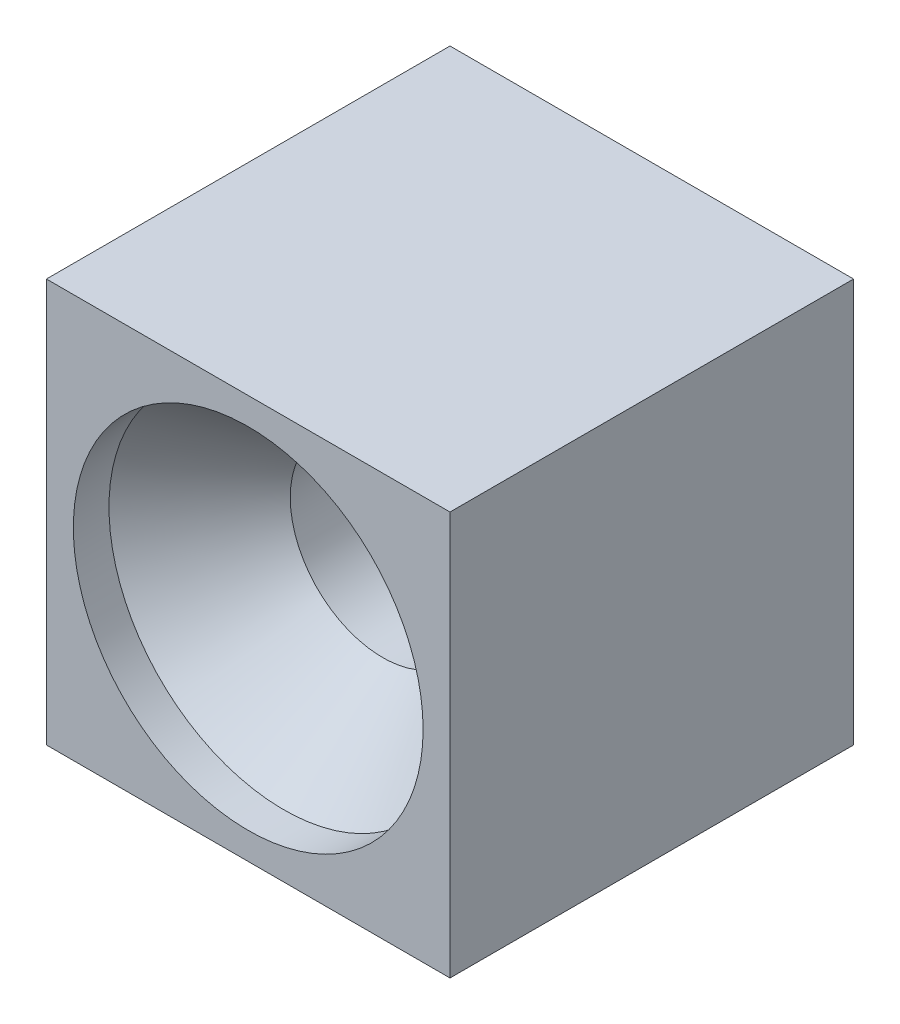
ISO-10303-21;
HEADER;
FILE_DESCRIPTION(('STEP AP214'),'2;1');
FILE_NAME('part.step','',(''),(''),'','','');
FILE_SCHEMA(('AUTOMOTIVE_DESIGN { 1 0 10303 214 1 1 1 1 }'));
ENDSEC;
DATA;
#1=APPLICATION_CONTEXT('core data for automotive mechanical design processes');
#2=APPLICATION_PROTOCOL_DEFINITION('international standard','automotive_design',2000,#1);
#3=PRODUCT_CONTEXT('',#1,'mechanical');
#4=PRODUCT('Part','Part','',(#3));
#5=PRODUCT_RELATED_PRODUCT_CATEGORY('part','',(#4));
#6=PRODUCT_DEFINITION_FORMATION('','',#4);
#7=PRODUCT_DEFINITION_CONTEXT('part definition',#1,'design');
#8=PRODUCT_DEFINITION('design','',#6,#7);
#9=PRODUCT_DEFINITION_SHAPE('','',#8);
#10=(LENGTH_UNIT() NAMED_UNIT(*) SI_UNIT(.MILLI.,.METRE.));
#11=(NAMED_UNIT(*) PLANE_ANGLE_UNIT() SI_UNIT($,.RADIAN.));
#12=(NAMED_UNIT(*) SI_UNIT($,.STERADIAN.) SOLID_ANGLE_UNIT());
#13=UNCERTAINTY_MEASURE_WITH_UNIT(LENGTH_MEASURE(1.E-05),#10,'distance_accuracy_value','');
#14=(GEOMETRIC_REPRESENTATION_CONTEXT(3) GLOBAL_UNCERTAINTY_ASSIGNED_CONTEXT((#13)) GLOBAL_UNIT_ASSIGNED_CONTEXT((#10,
#11,#12)) REPRESENTATION_CONTEXT('',''));
#15=CARTESIAN_POINT('',(0.,0.,0.));
#16=DIRECTION('',(0.,0.,1.));
#17=DIRECTION('',(1.,0.,0.));
#18=AXIS2_PLACEMENT_3D('',#15,#16,#17);
#19=CARTESIAN_POINT('',(0.,0.,12.));
#20=DIRECTION('',(0.,0.,-1.));
#21=DIRECTION('',(-1.,0.,0.));
#22=AXIS2_PLACEMENT_3D('',#19,#20,#21);
#23=CYLINDRICAL_SURFACE('',#22,2.75);
#24=CARTESIAN_POINT('',(0.,0.,0.5));
#25=DIRECTION('',(0.,0.,1.));
#26=DIRECTION('',(1.,0.,0.));
#27=AXIS2_PLACEMENT_3D('',#24,#25,#26);
#28=CIRCLE('',#27,2.75);
#29=CARTESIAN_POINT('',(2.75,0.,0.5));
#30=VERTEX_POINT('',#29);
#31=EDGE_CURVE('E11',#30,#30,#28,.F.);
#32=ORIENTED_EDGE('',*,*,#31,.T.);
#33=EDGE_LOOP('',(#32));
#34=FACE_BOUND('',#33,.T.);
#35=CARTESIAN_POINT('',(0.,0.,7.99999999999998));
#36=DIRECTION('',(0.,0.,1.));
#37=DIRECTION('',(1.,0.,0.));
#38=AXIS2_PLACEMENT_3D('',#35,#36,#37);
#39=CIRCLE('',#38,2.75);
#40=CARTESIAN_POINT('',(2.75,0.,7.99999999999998));
#41=VERTEX_POINT('',#40);
#42=EDGE_CURVE('E116',#41,#41,#39,.T.);
#43=ORIENTED_EDGE('',*,*,#42,.T.);
#44=EDGE_LOOP('',(#43));
#45=FACE_BOUND('',#44,.T.);
#46=ADVANCED_FACE('F37',(#34,#45),#23,.F.);
#47=CARTESIAN_POINT('',(0.,0.,12.));
#48=DIRECTION('',(0.,0.,1.));
#49=DIRECTION('',(1.,0.,0.));
#50=AXIS2_PLACEMENT_3D('',#47,#48,#49);
#51=PLANE('',#50);
#52=CARTESIAN_POINT('',(0.,0.,12.));
#53=DIRECTION('',(0.,0.,1.));
#54=DIRECTION('',(1.,0.,0.));
#55=AXIS2_PLACEMENT_3D('',#52,#53,#54);
#56=CIRCLE('',#55,5.2);
#57=CARTESIAN_POINT('',(5.2,0.,12.));
#58=VERTEX_POINT('',#57);
#59=EDGE_CURVE('E109',#58,#58,#56,.T.);
#60=ORIENTED_EDGE('',*,*,#59,.F.);
#61=EDGE_LOOP('',(#60));
#62=FACE_BOUND('',#61,.T.);
#63=DIRECTION('',(0.,-1.,0.));
#64=VECTOR('',#63,1.);
#65=CARTESIAN_POINT('',(-6.,6.,12.));
#66=LINE('',#65,#64);
#67=CARTESIAN_POINT('',(-6.,6.,12.));
#68=VERTEX_POINT('',#67);
#69=CARTESIAN_POINT('',(-6.,-6.,12.));
#70=VERTEX_POINT('',#69);
#71=EDGE_CURVE('E91',#68,#70,#66,.T.);
#72=ORIENTED_EDGE('',*,*,#71,.T.);
#73=DIRECTION('',(1.,0.,0.));
#74=VECTOR('',#73,1.);
#75=CARTESIAN_POINT('',(-6.,-6.,12.));
#76=LINE('',#75,#74);
#77=CARTESIAN_POINT('',(6.,-6.,12.));
#78=VERTEX_POINT('',#77);
#79=EDGE_CURVE('E86',#70,#78,#76,.T.);
#80=ORIENTED_EDGE('',*,*,#79,.T.);
#81=DIRECTION('',(0.,1.,0.));
#82=VECTOR('',#81,1.);
#83=CARTESIAN_POINT('',(6.,6.,12.));
#84=LINE('',#83,#82);
#85=CARTESIAN_POINT('',(6.,6.,12.));
#86=VERTEX_POINT('',#85);
#87=EDGE_CURVE('E89',#78,#86,#84,.T.);
#88=ORIENTED_EDGE('',*,*,#87,.T.);
#89=DIRECTION('',(-1.,0.,0.));
#90=VECTOR('',#89,1.);
#91=CARTESIAN_POINT('',(-6.,6.,12.));
#92=LINE('',#91,#90);
#93=EDGE_CURVE('E55',#86,#68,#92,.T.);
#94=ORIENTED_EDGE('',*,*,#93,.T.);
#95=EDGE_LOOP('',(#72,#80,#88,#94));
#96=FACE_BOUND('',#95,.T.);
#97=ADVANCED_FACE('F87',(#62,#96),#51,.T.);
#98=CARTESIAN_POINT('',(0.,0.,0.));
#99=DIRECTION('',(0.,0.,1.));
#100=DIRECTION('',(1.,0.,0.));
#101=AXIS2_PLACEMENT_3D('',#98,#99,#100);
#102=PLANE('',#101);
#103=CARTESIAN_POINT('',(0.,0.,0.));
#104=DIRECTION('',(0.,0.,1.));
#105=DIRECTION('',(1.,0.,0.));
#106=AXIS2_PLACEMENT_3D('',#103,#104,#105);
#107=CIRCLE('',#106,3.25);
#108=CARTESIAN_POINT('',(3.25,0.,0.));
#109=VERTEX_POINT('',#108);
#110=EDGE_CURVE('E47',#109,#109,#107,.T.);
#111=ORIENTED_EDGE('',*,*,#110,.T.);
#112=EDGE_LOOP('',(#111));
#113=FACE_BOUND('',#112,.T.);
#114=DIRECTION('',(0.,-1.,0.));
#115=VECTOR('',#114,1.);
#116=CARTESIAN_POINT('',(-6.,6.,0.));
#117=LINE('',#116,#115);
#118=CARTESIAN_POINT('',(-6.,6.,0.));
#119=VERTEX_POINT('',#118);
#120=CARTESIAN_POINT('',(-6.,-6.,0.));
#121=VERTEX_POINT('',#120);
#122=EDGE_CURVE('E106',#119,#121,#117,.T.);
#123=ORIENTED_EDGE('',*,*,#122,.F.);
#124=DIRECTION('',(-1.,0.,0.));
#125=VECTOR('',#124,1.);
#126=CARTESIAN_POINT('',(-6.,6.,0.));
#127=LINE('',#126,#125);
#128=CARTESIAN_POINT('',(6.,6.,0.));
#129=VERTEX_POINT('',#128);
#130=EDGE_CURVE('E78',#129,#119,#127,.T.);
#131=ORIENTED_EDGE('',*,*,#130,.F.);
#132=DIRECTION('',(0.,1.,0.));
#133=VECTOR('',#132,1.);
#134=CARTESIAN_POINT('',(6.,6.,0.));
#135=LINE('',#134,#133);
#136=CARTESIAN_POINT('',(6.,-6.,0.));
#137=VERTEX_POINT('',#136);
#138=EDGE_CURVE('E72',#137,#129,#135,.T.);
#139=ORIENTED_EDGE('',*,*,#138,.F.);
#140=DIRECTION('',(1.,0.,0.));
#141=VECTOR('',#140,1.);
#142=CARTESIAN_POINT('',(-6.,-6.,0.));
#143=LINE('',#142,#141);
#144=EDGE_CURVE('E96',#121,#137,#143,.T.);
#145=ORIENTED_EDGE('',*,*,#144,.F.);
#146=EDGE_LOOP('',(#123,#131,#139,#145));
#147=FACE_BOUND('',#146,.T.);
#148=ADVANCED_FACE('F124',(#113,#147),#102,.F.);
#149=CARTESIAN_POINT('',(-6.,6.,12.));
#150=DIRECTION('',(1.,0.,0.));
#151=DIRECTION('',(0.,1.,0.));
#152=AXIS2_PLACEMENT_3D('',#149,#150,#151);
#153=PLANE('',#152);
#154=ORIENTED_EDGE('',*,*,#122,.T.);
#155=DIRECTION('',(0.,0.,-1.));
#156=VECTOR('',#155,1.);
#157=CARTESIAN_POINT('',(-6.,-6.,12.));
#158=LINE('',#157,#156);
#159=EDGE_CURVE('E97',#70,#121,#158,.T.);
#160=ORIENTED_EDGE('',*,*,#159,.F.);
#161=ORIENTED_EDGE('',*,*,#71,.F.);
#162=DIRECTION('',(0.,0.,-1.));
#163=VECTOR('',#162,1.);
#164=CARTESIAN_POINT('',(-6.,6.,12.));
#165=LINE('',#164,#163);
#166=EDGE_CURVE('E102',#68,#119,#165,.T.);
#167=ORIENTED_EDGE('',*,*,#166,.T.);
#168=EDGE_LOOP('',(#154,#160,#161,#167));
#169=FACE_BOUND('',#168,.T.);
#170=ADVANCED_FACE('F149',(#169),#153,.F.);
#171=CARTESIAN_POINT('',(-6.,-6.,12.));
#172=DIRECTION('',(0.,1.,0.));
#173=DIRECTION('',(0.,0.,1.));
#174=AXIS2_PLACEMENT_3D('',#171,#172,#173);
#175=PLANE('',#174);
#176=ORIENTED_EDGE('',*,*,#144,.T.);
#177=DIRECTION('',(0.,0.,-1.));
#178=VECTOR('',#177,1.);
#179=CARTESIAN_POINT('',(6.,-6.,12.));
#180=LINE('',#179,#178);
#181=EDGE_CURVE('E94',#78,#137,#180,.T.);
#182=ORIENTED_EDGE('',*,*,#181,.F.);
#183=ORIENTED_EDGE('',*,*,#79,.F.);
#184=ORIENTED_EDGE('',*,*,#159,.T.);
#185=EDGE_LOOP('',(#176,#182,#183,#184));
#186=FACE_BOUND('',#185,.T.);
#187=ADVANCED_FACE('F95',(#186),#175,.F.);
#188=CARTESIAN_POINT('',(6.,6.,12.));
#189=DIRECTION('',(-1.,0.,0.));
#190=DIRECTION('',(0.,0.,1.));
#191=AXIS2_PLACEMENT_3D('',#188,#189,#190);
#192=PLANE('',#191);
#193=ORIENTED_EDGE('',*,*,#138,.T.);
#194=DIRECTION('',(0.,0.,-1.));
#195=VECTOR('',#194,1.);
#196=CARTESIAN_POINT('',(6.,6.,12.));
#197=LINE('',#196,#195);
#198=EDGE_CURVE('E98',#86,#129,#197,.T.);
#199=ORIENTED_EDGE('',*,*,#198,.F.);
#200=ORIENTED_EDGE('',*,*,#87,.F.);
#201=ORIENTED_EDGE('',*,*,#181,.T.);
#202=EDGE_LOOP('',(#193,#199,#200,#201));
#203=FACE_BOUND('',#202,.T.);
#204=ADVANCED_FACE('F100',(#203),#192,.F.);
#205=CARTESIAN_POINT('',(-6.,6.,12.));
#206=DIRECTION('',(0.,-1.,0.));
#207=DIRECTION('',(0.,0.,-1.));
#208=AXIS2_PLACEMENT_3D('',#205,#206,#207);
#209=PLANE('',#208);
#210=ORIENTED_EDGE('',*,*,#130,.T.);
#211=ORIENTED_EDGE('',*,*,#166,.F.);
#212=ORIENTED_EDGE('',*,*,#93,.F.);
#213=ORIENTED_EDGE('',*,*,#198,.T.);
#214=EDGE_LOOP('',(#210,#211,#212,#213));
#215=FACE_BOUND('',#214,.T.);
#216=ADVANCED_FACE('F150',(#215),#209,.F.);
#217=CARTESIAN_POINT('',(0.,0.,11.));
#218=DIRECTION('',(0.,0.,1.));
#219=DIRECTION('',(1.,0.,0.));
#220=AXIS2_PLACEMENT_3D('',#217,#218,#219);
#221=CYLINDRICAL_SURFACE('',#220,5.2);
#222=CARTESIAN_POINT('',(0.,0.,10.94));
#223=DIRECTION('',(0.,0.,1.));
#224=DIRECTION('',(1.,0.,0.));
#225=AXIS2_PLACEMENT_3D('',#222,#223,#224);
#226=CIRCLE('',#225,5.2);
#227=CARTESIAN_POINT('',(5.2,0.,10.94));
#228=VERTEX_POINT('',#227);
#229=EDGE_CURVE('E119',#228,#228,#226,.F.);
#230=ORIENTED_EDGE('',*,*,#229,.T.);
#231=EDGE_LOOP('',(#230));
#232=FACE_BOUND('',#231,.T.);
#233=ORIENTED_EDGE('',*,*,#59,.T.);
#234=EDGE_LOOP('',(#233));
#235=FACE_BOUND('',#234,.T.);
#236=ADVANCED_FACE('F133',(#232,#235),#221,.F.);
#237=CARTESIAN_POINT('',(0.,0.,7.99999999999998));
#238=DIRECTION('',(0.,0.,1.));
#239=DIRECTION('',(1.,0.,0.));
#240=AXIS2_PLACEMENT_3D('',#237,#238,#239);
#241=CONICAL_SURFACE('',#240,2.75,0.694738276196704);
#242=ORIENTED_EDGE('',*,*,#229,.F.);
#243=EDGE_LOOP('',(#242));
#244=FACE_BOUND('',#243,.T.);
#245=ORIENTED_EDGE('',*,*,#42,.F.);
#246=EDGE_LOOP('',(#245));
#247=FACE_BOUND('',#246,.T.);
#248=ADVANCED_FACE('F128',(#244,#247),#241,.F.);
#249=CARTESIAN_POINT('',(0.,0.,0.));
#250=DIRECTION('',(0.,0.,-1.));
#251=DIRECTION('',(-1.,0.,0.));
#252=AXIS2_PLACEMENT_3D('',#249,#250,#251);
#253=CONICAL_SURFACE('',#252,3.25,0.785398163397447);
#254=ORIENTED_EDGE('',*,*,#31,.F.);
#255=EDGE_LOOP('',(#254));
#256=FACE_BOUND('',#255,.T.);
#257=ORIENTED_EDGE('',*,*,#110,.F.);
#258=EDGE_LOOP('',(#257));
#259=FACE_BOUND('',#258,.T.);
#260=ADVANCED_FACE('F40',(#256,#259),#253,.F.);
#261=CLOSED_SHELL('',(#46,#97,#148,#170,#187,#204,#216,#236,#248,#260));
#262=MANIFOLD_SOLID_BREP('B2',#261);
#263=ADVANCED_BREP_SHAPE_REPRESENTATION('',(#18,#262),#14);
#264=SHAPE_DEFINITION_REPRESENTATION(#9,#263);
ENDSEC;
END-ISO-10303-21;
